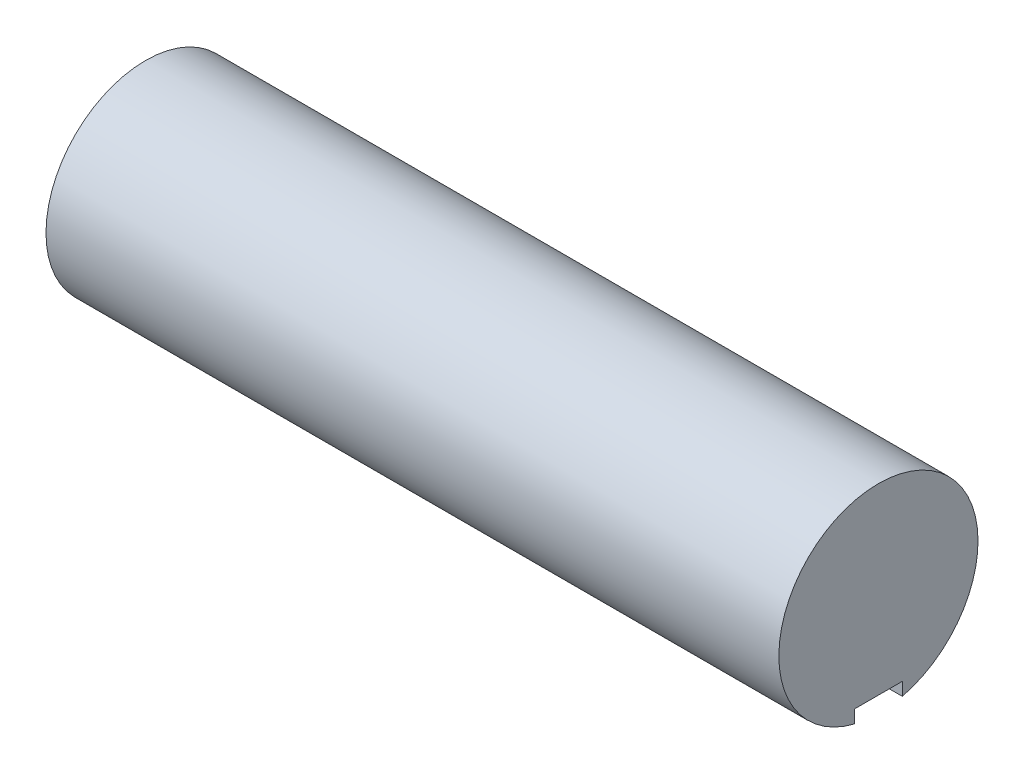
ISO-10303-21;
HEADER;
FILE_DESCRIPTION(('STEP AP214'),'2;1');
FILE_NAME('part.step','',(''),(''),'','','');
FILE_SCHEMA(('AUTOMOTIVE_DESIGN { 1 0 10303 214 1 1 1 1 }'));
ENDSEC;
DATA;
#1=APPLICATION_CONTEXT('core data for automotive mechanical design processes');
#2=APPLICATION_PROTOCOL_DEFINITION('international standard','automotive_design',2000,#1);
#3=PRODUCT_CONTEXT('',#1,'mechanical');
#4=PRODUCT('Part','Part','',(#3));
#5=PRODUCT_RELATED_PRODUCT_CATEGORY('part','',(#4));
#6=PRODUCT_DEFINITION_FORMATION('','',#4);
#7=PRODUCT_DEFINITION_CONTEXT('part definition',#1,'design');
#8=PRODUCT_DEFINITION('design','',#6,#7);
#9=PRODUCT_DEFINITION_SHAPE('','',#8);
#10=(LENGTH_UNIT() NAMED_UNIT(*) SI_UNIT(.MILLI.,.METRE.));
#11=(NAMED_UNIT(*) PLANE_ANGLE_UNIT() SI_UNIT($,.RADIAN.));
#12=(NAMED_UNIT(*) SI_UNIT($,.STERADIAN.) SOLID_ANGLE_UNIT());
#13=UNCERTAINTY_MEASURE_WITH_UNIT(LENGTH_MEASURE(1.E-05),#10,'distance_accuracy_value','');
#14=(GEOMETRIC_REPRESENTATION_CONTEXT(3) GLOBAL_UNCERTAINTY_ASSIGNED_CONTEXT((#13)) GLOBAL_UNIT_ASSIGNED_CONTEXT((#10,
#11,#12)) REPRESENTATION_CONTEXT('',''));
#15=CARTESIAN_POINT('',(0.,0.,0.));
#16=DIRECTION('',(0.,0.,1.));
#17=DIRECTION('',(1.,0.,0.));
#18=AXIS2_PLACEMENT_3D('',#15,#16,#17);
#19=CARTESIAN_POINT('',(46.,0.,0.));
#20=DIRECTION('',(-1.,0.,0.));
#21=DIRECTION('',(0.,0.,1.));
#22=AXIS2_PLACEMENT_3D('',#19,#20,#21);
#23=CYLINDRICAL_SURFACE('',#22,6.25);
#24=CARTESIAN_POINT('',(0.,0.,0.));
#25=DIRECTION('',(1.,0.,0.));
#26=DIRECTION('',(0.,0.,-1.));
#27=AXIS2_PLACEMENT_3D('',#24,#25,#26);
#28=CIRCLE('',#27,6.25);
#29=CARTESIAN_POINT('',(0.,-6.0673305497558,-1.5));
#30=VERTEX_POINT('',#29);
#31=CARTESIAN_POINT('',(0.,-6.0673305497558,1.5));
#32=VERTEX_POINT('',#31);
#33=EDGE_CURVE('E102',#30,#32,#28,.T.);
#34=ORIENTED_EDGE('',*,*,#33,.T.);
#35=DIRECTION('',(-1.,0.,0.));
#36=VECTOR('',#35,1.);
#37=CARTESIAN_POINT('',(46.,-6.0673305497558,1.5));
#38=LINE('',#37,#36);
#39=CARTESIAN_POINT('',(46.,-6.0673305497558,1.5));
#40=VERTEX_POINT('',#39);
#41=EDGE_CURVE('E100',#32,#40,#38,.F.);
#42=ORIENTED_EDGE('',*,*,#41,.T.);
#43=CARTESIAN_POINT('',(46.,0.,0.));
#44=DIRECTION('',(1.,0.,0.));
#45=DIRECTION('',(0.,0.,-1.));
#46=AXIS2_PLACEMENT_3D('',#43,#44,#45);
#47=CIRCLE('',#46,6.25);
#48=CARTESIAN_POINT('',(46.,-6.0673305497558,-1.5));
#49=VERTEX_POINT('',#48);
#50=EDGE_CURVE('E43',#49,#40,#47,.T.);
#51=ORIENTED_EDGE('',*,*,#50,.F.);
#52=DIRECTION('',(-1.,0.,0.));
#53=VECTOR('',#52,1.);
#54=CARTESIAN_POINT('',(46.,-6.0673305497558,-1.5));
#55=LINE('',#54,#53);
#56=EDGE_CURVE('E96',#49,#30,#55,.T.);
#57=ORIENTED_EDGE('',*,*,#56,.T.);
#58=EDGE_LOOP('',(#34,#42,#51,#57));
#59=FACE_BOUND('',#58,.T.);
#60=ADVANCED_FACE('F36',(#59),#23,.T.);
#61=CARTESIAN_POINT('',(46.,0.,0.));
#62=DIRECTION('',(1.,0.,0.));
#63=DIRECTION('',(0.,0.,-1.));
#64=AXIS2_PLACEMENT_3D('',#61,#62,#63);
#65=PLANE('',#64);
#66=DIRECTION('',(0.,1.,0.));
#67=VECTOR('',#66,1.);
#68=CARTESIAN_POINT('',(46.,-7.25,1.5));
#69=LINE('',#68,#67);
#70=CARTESIAN_POINT('',(46.,-5.25,1.5));
#71=VERTEX_POINT('',#70);
#72=EDGE_CURVE('E57',#40,#71,#69,.T.);
#73=ORIENTED_EDGE('',*,*,#72,.T.);
#74=DIRECTION('',(0.,0.,-1.));
#75=VECTOR('',#74,1.);
#76=CARTESIAN_POINT('',(46.,-5.25,-1.5));
#77=LINE('',#76,#75);
#78=CARTESIAN_POINT('',(46.,-5.25,-1.5));
#79=VERTEX_POINT('',#78);
#80=EDGE_CURVE('E80',#71,#79,#77,.T.);
#81=ORIENTED_EDGE('',*,*,#80,.T.);
#82=DIRECTION('',(0.,-1.,0.));
#83=VECTOR('',#82,1.);
#84=CARTESIAN_POINT('',(46.,-7.25,-1.5));
#85=LINE('',#84,#83);
#86=EDGE_CURVE('E77',#79,#49,#85,.T.);
#87=ORIENTED_EDGE('',*,*,#86,.T.);
#88=ORIENTED_EDGE('',*,*,#50,.T.);
#89=EDGE_LOOP('',(#73,#81,#87,#88));
#90=FACE_BOUND('',#89,.T.);
#91=ADVANCED_FACE('F87',(#90),#65,.T.);
#92=CARTESIAN_POINT('',(0.,0.,0.));
#93=DIRECTION('',(1.,0.,0.));
#94=DIRECTION('',(0.,0.,-1.));
#95=AXIS2_PLACEMENT_3D('',#92,#93,#94);
#96=PLANE('',#95);
#97=DIRECTION('',(0.,0.,-1.));
#98=VECTOR('',#97,1.);
#99=CARTESIAN_POINT('',(0.,-5.25,-1.5));
#100=LINE('',#99,#98);
#101=CARTESIAN_POINT('',(0.,-5.25,1.5));
#102=VERTEX_POINT('',#101);
#103=CARTESIAN_POINT('',(0.,-5.25,-1.5));
#104=VERTEX_POINT('',#103);
#105=EDGE_CURVE('E91',#102,#104,#100,.T.);
#106=ORIENTED_EDGE('',*,*,#105,.F.);
#107=DIRECTION('',(0.,-1.,0.));
#108=VECTOR('',#107,1.);
#109=CARTESIAN_POINT('',(0.,0.,1.5));
#110=LINE('',#109,#108);
#111=EDGE_CURVE('E11',#102,#32,#110,.T.);
#112=ORIENTED_EDGE('',*,*,#111,.T.);
#113=ORIENTED_EDGE('',*,*,#33,.F.);
#114=DIRECTION('',(0.,-1.,0.));
#115=VECTOR('',#114,1.);
#116=CARTESIAN_POINT('',(0.,-7.25,-1.5));
#117=LINE('',#116,#115);
#118=EDGE_CURVE('E89',#104,#30,#117,.T.);
#119=ORIENTED_EDGE('',*,*,#118,.F.);
#120=EDGE_LOOP('',(#106,#112,#113,#119));
#121=FACE_BOUND('',#120,.T.);
#122=ADVANCED_FACE('F108',(#121),#96,.F.);
#123=CARTESIAN_POINT('',(46.,-7.25,1.5));
#124=DIRECTION('',(0.,0.,1.));
#125=DIRECTION('',(1.,0.,0.));
#126=AXIS2_PLACEMENT_3D('',#123,#124,#125);
#127=PLANE('',#126);
#128=ORIENTED_EDGE('',*,*,#111,.F.);
#129=DIRECTION('',(-1.,0.,0.));
#130=VECTOR('',#129,1.);
#131=CARTESIAN_POINT('',(46.,-5.25,1.5));
#132=LINE('',#131,#130);
#133=EDGE_CURVE('E50',#71,#102,#132,.T.);
#134=ORIENTED_EDGE('',*,*,#133,.F.);
#135=ORIENTED_EDGE('',*,*,#72,.F.);
#136=ORIENTED_EDGE('',*,*,#41,.F.);
#137=EDGE_LOOP('',(#128,#134,#135,#136));
#138=FACE_BOUND('',#137,.T.);
#139=ADVANCED_FACE('F74',(#138),#127,.F.);
#140=CARTESIAN_POINT('',(46.,-7.25,-1.5));
#141=DIRECTION('',(0.,0.,-1.));
#142=DIRECTION('',(-1.,0.,0.));
#143=AXIS2_PLACEMENT_3D('',#140,#141,#142);
#144=PLANE('',#143);
#145=ORIENTED_EDGE('',*,*,#86,.F.);
#146=DIRECTION('',(-1.,0.,0.));
#147=VECTOR('',#146,1.);
#148=CARTESIAN_POINT('',(46.,-5.25,-1.5));
#149=LINE('',#148,#147);
#150=EDGE_CURVE('E76',#79,#104,#149,.T.);
#151=ORIENTED_EDGE('',*,*,#150,.T.);
#152=ORIENTED_EDGE('',*,*,#118,.T.);
#153=ORIENTED_EDGE('',*,*,#56,.F.);
#154=EDGE_LOOP('',(#145,#151,#152,#153));
#155=FACE_BOUND('',#154,.T.);
#156=ADVANCED_FACE('F110',(#155),#144,.F.);
#157=CARTESIAN_POINT('',(46.,-5.25,-1.5));
#158=DIRECTION('',(0.,1.,0.));
#159=DIRECTION('',(0.,0.,1.));
#160=AXIS2_PLACEMENT_3D('',#157,#158,#159);
#161=PLANE('',#160);
#162=ORIENTED_EDGE('',*,*,#105,.T.);
#163=ORIENTED_EDGE('',*,*,#150,.F.);
#164=ORIENTED_EDGE('',*,*,#80,.F.);
#165=ORIENTED_EDGE('',*,*,#133,.T.);
#166=EDGE_LOOP('',(#162,#163,#164,#165));
#167=FACE_BOUND('',#166,.T.);
#168=ADVANCED_FACE('F81',(#167),#161,.F.);
#169=CLOSED_SHELL('',(#60,#91,#122,#139,#156,#168));
#170=MANIFOLD_SOLID_BREP('B2',#169);
#171=ADVANCED_BREP_SHAPE_REPRESENTATION('',(#18,#170),#14);
#172=SHAPE_DEFINITION_REPRESENTATION(#9,#171);
ENDSEC;
END-ISO-10303-21;
